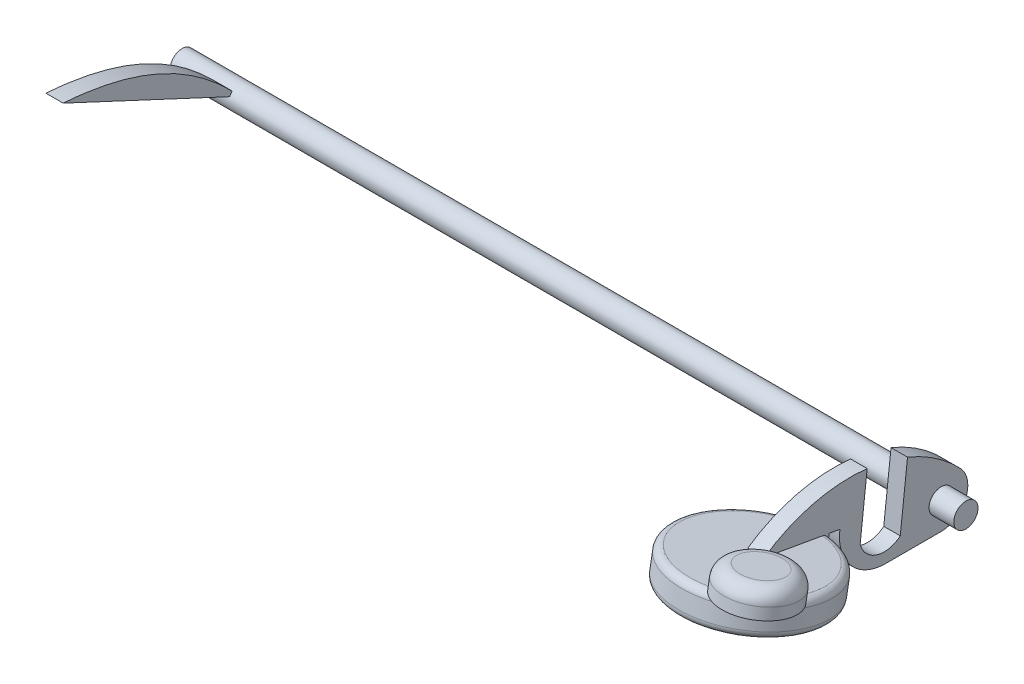
ISO-10303-21;
HEADER;
FILE_DESCRIPTION(('STEP AP214'),'2;1');
FILE_NAME('part.step','',(''),(''),'','','');
FILE_SCHEMA(('AUTOMOTIVE_DESIGN { 1 0 10303 214 1 1 1 1 }'));
ENDSEC;
DATA;
#1=APPLICATION_CONTEXT('core data for automotive mechanical design processes');
#2=APPLICATION_PROTOCOL_DEFINITION('international standard','automotive_design',2000,#1);
#3=PRODUCT_CONTEXT('',#1,'mechanical');
#4=PRODUCT('Part','Part','',(#3));
#5=PRODUCT_RELATED_PRODUCT_CATEGORY('part','',(#4));
#6=PRODUCT_DEFINITION_FORMATION('','',#4);
#7=PRODUCT_DEFINITION_CONTEXT('part definition',#1,'design');
#8=PRODUCT_DEFINITION('design','',#6,#7);
#9=PRODUCT_DEFINITION_SHAPE('','',#8);
#10=(LENGTH_UNIT() NAMED_UNIT(*) SI_UNIT(.MILLI.,.METRE.));
#11=(NAMED_UNIT(*) PLANE_ANGLE_UNIT() SI_UNIT($,.RADIAN.));
#12=(NAMED_UNIT(*) SI_UNIT($,.STERADIAN.) SOLID_ANGLE_UNIT());
#13=UNCERTAINTY_MEASURE_WITH_UNIT(LENGTH_MEASURE(1.E-05),#10,'distance_accuracy_value','');
#14=(GEOMETRIC_REPRESENTATION_CONTEXT(3) GLOBAL_UNCERTAINTY_ASSIGNED_CONTEXT((#13)) GLOBAL_UNIT_ASSIGNED_CONTEXT((#10,
#11,#12)) REPRESENTATION_CONTEXT('',''));
#15=CARTESIAN_POINT('',(0.,0.,0.));
#16=DIRECTION('',(0.,0.,1.));
#17=DIRECTION('',(1.,0.,0.));
#18=AXIS2_PLACEMENT_3D('',#15,#16,#17);
#19=CARTESIAN_POINT('',(144.7292,0.,0.));
#20=DIRECTION('',(-1.,0.,0.));
#21=DIRECTION('',(0.,0.,1.));
#22=AXIS2_PLACEMENT_3D('',#19,#20,#21);
#23=CYLINDRICAL_SURFACE('',#22,2.2352);
#24=CARTESIAN_POINT('',(144.7292,0.,0.));
#25=DIRECTION('',(1.,0.,0.));
#26=DIRECTION('',(0.,0.,-1.));
#27=AXIS2_PLACEMENT_3D('',#24,#25,#26);
#28=CIRCLE('',#27,2.2352);
#29=CARTESIAN_POINT('',(144.7292,0.,-2.2352));
#30=VERTEX_POINT('',#29);
#31=EDGE_CURVE('E288',#30,#30,#28,.T.);
#32=ORIENTED_EDGE('',*,*,#31,.F.);
#33=EDGE_LOOP('',(#32));
#34=FACE_BOUND('',#33,.T.);
#35=CARTESIAN_POINT('',(140.1572,0.,0.));
#36=DIRECTION('',(-1.,0.,0.));
#37=DIRECTION('',(0.,0.,1.));
#38=AXIS2_PLACEMENT_3D('',#35,#36,#37);
#39=CIRCLE('',#38,2.2352);
#40=CARTESIAN_POINT('',(140.1572,0.,2.2352));
#41=VERTEX_POINT('',#40);
#42=EDGE_CURVE('E292',#41,#41,#39,.T.);
#43=ORIENTED_EDGE('',*,*,#42,.F.);
#44=EDGE_LOOP('',(#43));
#45=FACE_BOUND('',#44,.T.);
#46=ADVANCED_FACE('F39',(#34,#45),#23,.T.);
#47=CARTESIAN_POINT('',(144.7292,0.,0.));
#48=DIRECTION('',(1.,0.,0.));
#49=DIRECTION('',(0.,0.,-1.));
#50=AXIS2_PLACEMENT_3D('',#47,#48,#49);
#51=PLANE('',#50);
#52=ORIENTED_EDGE('',*,*,#31,.T.);
#53=EDGE_LOOP('',(#52));
#54=FACE_BOUND('',#53,.T.);
#55=ADVANCED_FACE('F390',(#54),#51,.T.);
#56=CARTESIAN_POINT('',(140.1572,4.7752,18.6944));
#57=DIRECTION('',(0.,-0.984807753012208,0.173648177666931));
#58=DIRECTION('',(0.,-0.173648177666931,-0.984807753012208));
#59=AXIS2_PLACEMENT_3D('',#56,#57,#58);
#60=PLANE('',#59);
#61=DIRECTION('',(0.,0.173648177666931,0.984807753012208));
#62=VECTOR('',#61,1.);
#63=CARTESIAN_POINT('',(140.1572,4.7752,18.6944));
#64=LINE('',#63,#62);
#65=CARTESIAN_POINT('',(140.1572,4.7752,18.6944));
#66=VERTEX_POINT('',#65);
#67=CARTESIAN_POINT('',(140.1572,5.12159028491411,20.6588769253256));
#68=VERTEX_POINT('',#67);
#69=EDGE_CURVE('E189',#66,#68,#64,.T.);
#70=ORIENTED_EDGE('',*,*,#69,.T.);
#71=CARTESIAN_POINT('',(138.6332,7.35984893566567,33.3526725189349));
#72=DIRECTION('',(0.,-0.984807753012208,0.173648177666931));
#73=DIRECTION('',(0.,-0.173648177666931,-0.984807753012208));
#74=AXIS2_PLACEMENT_3D('',#71,#72,#73);
#75=CIRCLE('',#74,12.9794);
#76=CARTESIAN_POINT('',(137.1092,5.12159028491411,20.6588769253256));
#77=VERTEX_POINT('',#76);
#78=EDGE_CURVE('E181',#77,#68,#75,.T.);
#79=ORIENTED_EDGE('',*,*,#78,.F.);
#80=DIRECTION('',(0.,0.173648177666931,0.984807753012208));
#81=VECTOR('',#80,1.);
#82=CARTESIAN_POINT('',(137.1092,4.7752,18.6944));
#83=LINE('',#82,#81);
#84=CARTESIAN_POINT('',(137.1092,4.7752,18.6944));
#85=VERTEX_POINT('',#84);
#86=EDGE_CURVE('E225',#85,#77,#83,.T.);
#87=ORIENTED_EDGE('',*,*,#86,.F.);
#88=DIRECTION('',(-1.,0.,0.));
#89=VECTOR('',#88,1.);
#90=CARTESIAN_POINT('',(140.1572,4.7752,18.6944));
#91=LINE('',#90,#89);
#92=EDGE_CURVE('E260',#66,#85,#91,.T.);
#93=ORIENTED_EDGE('',*,*,#92,.F.);
#94=EDGE_LOOP('',(#70,#79,#87,#93));
#95=FACE_BOUND('',#94,.T.);
#96=ADVANCED_FACE('F359',(#95),#60,.T.);
#97=CARTESIAN_POINT('',(140.1572,3.58653961984732,10.2636432150542));
#98=DIRECTION('',(-1.,0.,0.));
#99=DIRECTION('',(0.,0.,1.));
#100=AXIS2_PLACEMENT_3D('',#97,#98,#99);
#101=CYLINDRICAL_SURFACE('',#100,8.51413961984732);
#102=CARTESIAN_POINT('',(137.1092,3.58653961984732,10.2636432150542));
#103=DIRECTION('',(-1.,0.,0.));
#104=DIRECTION('',(0.,0.,1.));
#105=AXIS2_PLACEMENT_3D('',#102,#103,#104);
#106=CIRCLE('',#105,8.51413961984732);
#107=CARTESIAN_POINT('',(137.1092,-4.9276,10.2636432150542));
#108=VERTEX_POINT('',#107);
#109=EDGE_CURVE('E194',#108,#85,#106,.T.);
#110=ORIENTED_EDGE('',*,*,#109,.F.);
#111=DIRECTION('',(-1.,0.,0.));
#112=VECTOR('',#111,1.);
#113=CARTESIAN_POINT('',(140.1572,-4.9276,10.2636432150542));
#114=LINE('',#113,#112);
#115=CARTESIAN_POINT('',(140.1572,-4.9276,10.2636432150542));
#116=VERTEX_POINT('',#115);
#117=EDGE_CURVE('E264',#116,#108,#114,.T.);
#118=ORIENTED_EDGE('',*,*,#117,.F.);
#119=CARTESIAN_POINT('',(140.1572,3.58653961984732,10.2636432150542));
#120=DIRECTION('',(-1.,0.,0.));
#121=DIRECTION('',(0.,0.,1.));
#122=AXIS2_PLACEMENT_3D('',#119,#120,#121);
#123=CIRCLE('',#122,8.51413961984732);
#124=EDGE_CURVE('E220',#116,#66,#123,.T.);
#125=ORIENTED_EDGE('',*,*,#124,.T.);
#126=ORIENTED_EDGE('',*,*,#92,.T.);
#127=EDGE_LOOP('',(#110,#118,#125,#126));
#128=FACE_BOUND('',#127,.T.);
#129=ADVANCED_FACE('F355',(#128),#101,.T.);
#130=CARTESIAN_POINT('',(140.1572,-4.9276,0.));
#131=DIRECTION('',(0.,-1.,0.));
#132=DIRECTION('',(0.,0.,-1.));
#133=AXIS2_PLACEMENT_3D('',#130,#131,#132);
#134=PLANE('',#133);
#135=DIRECTION('',(0.,0.,1.));
#136=VECTOR('',#135,1.);
#137=CARTESIAN_POINT('',(137.1092,-4.9276,0.));
#138=LINE('',#137,#136);
#139=CARTESIAN_POINT('',(137.1092,-4.9276,0.));
#140=VERTEX_POINT('',#139);
#141=EDGE_CURVE('E253',#140,#108,#138,.T.);
#142=ORIENTED_EDGE('',*,*,#141,.F.);
#143=DIRECTION('',(-1.,0.,0.));
#144=VECTOR('',#143,1.);
#145=CARTESIAN_POINT('',(140.1572,-4.9276,0.));
#146=LINE('',#145,#144);
#147=CARTESIAN_POINT('',(140.1572,-4.9276,0.));
#148=VERTEX_POINT('',#147);
#149=EDGE_CURVE('E267',#148,#140,#146,.T.);
#150=ORIENTED_EDGE('',*,*,#149,.F.);
#151=DIRECTION('',(0.,0.,1.));
#152=VECTOR('',#151,1.);
#153=CARTESIAN_POINT('',(140.1572,-4.9276,0.));
#154=LINE('',#153,#152);
#155=EDGE_CURVE('E216',#148,#116,#154,.T.);
#156=ORIENTED_EDGE('',*,*,#155,.T.);
#157=ORIENTED_EDGE('',*,*,#117,.T.);
#158=EDGE_LOOP('',(#142,#150,#156,#157));
#159=FACE_BOUND('',#158,.T.);
#160=ADVANCED_FACE('F358',(#159),#134,.T.);
#161=CARTESIAN_POINT('',(140.1572,0.,0.));
#162=DIRECTION('',(-1.,0.,0.));
#163=DIRECTION('',(0.,0.,1.));
#164=AXIS2_PLACEMENT_3D('',#161,#162,#163);
#165=CYLINDRICAL_SURFACE('',#164,4.9276);
#166=CARTESIAN_POINT('',(137.1092,0.,0.));
#167=DIRECTION('',(1.,0.,0.));
#168=DIRECTION('',(0.,0.,-1.));
#169=AXIS2_PLACEMENT_3D('',#166,#167,#168);
#170=CIRCLE('',#169,4.9276);
#171=CARTESIAN_POINT('',(137.1092,3.13344970104761,-3.80299023546007));
#172=VERTEX_POINT('',#171);
#173=EDGE_CURVE('E249',#140,#172,#170,.T.);
#174=ORIENTED_EDGE('',*,*,#173,.T.);
#175=DIRECTION('',(-1.,0.,0.));
#176=VECTOR('',#175,1.);
#177=CARTESIAN_POINT('',(140.1572,3.13344970104761,-3.80299023546007));
#178=LINE('',#177,#176);
#179=CARTESIAN_POINT('',(140.1572,3.13344970104761,-3.80299023546007));
#180=VERTEX_POINT('',#179);
#181=EDGE_CURVE('E270',#180,#172,#178,.T.);
#182=ORIENTED_EDGE('',*,*,#181,.F.);
#183=CARTESIAN_POINT('',(140.1572,0.,0.));
#184=DIRECTION('',(1.,0.,0.));
#185=DIRECTION('',(0.,0.,-1.));
#186=AXIS2_PLACEMENT_3D('',#183,#184,#185);
#187=CIRCLE('',#186,4.9276);
#188=EDGE_CURVE('E213',#148,#180,#187,.T.);
#189=ORIENTED_EDGE('',*,*,#188,.F.);
#190=ORIENTED_EDGE('',*,*,#149,.T.);
#191=EDGE_LOOP('',(#174,#182,#189,#190));
#192=FACE_BOUND('',#191,.T.);
#193=ADVANCED_FACE('F363',(#192),#165,.T.);
#194=CARTESIAN_POINT('',(140.1572,-15.8782677364398,16.795222317976));
#195=DIRECTION('',(-1.,0.,0.));
#196=DIRECTION('',(0.,0.,1.));
#197=AXIS2_PLACEMENT_3D('',#194,#195,#196);
#198=CYLINDRICAL_SURFACE('',#197,28.0309072332559);
#199=CARTESIAN_POINT('',(137.1092,-15.8782677364398,16.795222317976));
#200=DIRECTION('',(-1.,0.,0.));
#201=DIRECTION('',(0.,0.,1.));
#202=AXIS2_PLACEMENT_3D('',#199,#200,#201);
#203=CIRCLE('',#202,28.0309072332559);
#204=CARTESIAN_POINT('',(137.1092,10.0755838638352,6.20610774543991));
#205=VERTEX_POINT('',#204);
#206=EDGE_CURVE('E245',#205,#172,#203,.T.);
#207=ORIENTED_EDGE('',*,*,#206,.F.);
#208=DIRECTION('',(-1.,0.,0.));
#209=VECTOR('',#208,1.);
#210=CARTESIAN_POINT('',(140.1572,10.0755838638352,6.20610774543991));
#211=LINE('',#210,#209);
#212=CARTESIAN_POINT('',(140.1572,10.0755838638352,6.20610774543991));
#213=VERTEX_POINT('',#212);
#214=EDGE_CURVE('E273',#213,#205,#211,.T.);
#215=ORIENTED_EDGE('',*,*,#214,.F.);
#216=CARTESIAN_POINT('',(140.1572,-15.8782677364398,16.795222317976));
#217=DIRECTION('',(-1.,0.,0.));
#218=DIRECTION('',(0.,0.,1.));
#219=AXIS2_PLACEMENT_3D('',#216,#217,#218);
#220=CIRCLE('',#219,28.0309072332559);
#221=EDGE_CURVE('E209',#213,#180,#220,.T.);
#222=ORIENTED_EDGE('',*,*,#221,.T.);
#223=ORIENTED_EDGE('',*,*,#181,.T.);
#224=EDGE_LOOP('',(#207,#215,#222,#223));
#225=FACE_BOUND('',#224,.T.);
#226=ADVANCED_FACE('F367',(#225),#198,.T.);
#227=CARTESIAN_POINT('',(140.1572,10.0755838638352,6.20610774543991));
#228=DIRECTION('',(0.,-0.111840077706122,-0.993726218341193));
#229=DIRECTION('',(0.,0.993726218341193,-0.111840077706122));
#230=AXIS2_PLACEMENT_3D('',#227,#228,#229);
#231=PLANE('',#230);
#232=DIRECTION('',(0.,-0.993726218341193,0.111840077706122));
#233=VECTOR('',#232,1.);
#234=CARTESIAN_POINT('',(137.1092,10.0755838638352,6.20610774543991));
#235=LINE('',#234,#233);
#236=CARTESIAN_POINT('',(137.1092,-1.84147561968343,7.54732712162788));
#237=VERTEX_POINT('',#236);
#238=EDGE_CURVE('E241',#205,#237,#235,.T.);
#239=ORIENTED_EDGE('',*,*,#238,.T.);
#240=DIRECTION('',(-1.,0.,0.));
#241=VECTOR('',#240,1.);
#242=CARTESIAN_POINT('',(140.1572,-1.84147561968343,7.54732712162788));
#243=LINE('',#242,#241);
#244=CARTESIAN_POINT('',(140.1572,-1.84147561968343,7.54732712162788));
#245=VERTEX_POINT('',#244);
#246=EDGE_CURVE('E276',#245,#237,#243,.T.);
#247=ORIENTED_EDGE('',*,*,#246,.F.);
#248=DIRECTION('',(0.,-0.993726218341193,0.111840077706122));
#249=VECTOR('',#248,1.);
#250=CARTESIAN_POINT('',(140.1572,10.0755838638352,6.20610774543991));
#251=LINE('',#250,#249);
#252=EDGE_CURVE('E206',#213,#245,#251,.T.);
#253=ORIENTED_EDGE('',*,*,#252,.F.);
#254=ORIENTED_EDGE('',*,*,#214,.T.);
#255=EDGE_LOOP('',(#239,#247,#253,#254));
#256=FACE_BOUND('',#255,.T.);
#257=ADVANCED_FACE('F371',(#256),#231,.F.);
#258=CARTESIAN_POINT('',(140.1572,1.66682268507252,10.5143041798017));
#259=DIRECTION('',(-1.,0.,0.));
#260=DIRECTION('',(0.,0.,1.));
#261=AXIS2_PLACEMENT_3D('',#258,#259,#260);
#262=CYLINDRICAL_SURFACE('',#261,4.5946827810942);
#263=CARTESIAN_POINT('',(137.1092,1.66682268507252,10.5143041798017));
#264=DIRECTION('',(1.,0.,0.));
#265=DIRECTION('',(0.,0.,-1.));
#266=AXIS2_PLACEMENT_3D('',#263,#264,#265);
#267=CIRCLE('',#266,4.5946827810942);
#268=CARTESIAN_POINT('',(137.1092,0.482900652114931,14.9538355152876));
#269=VERTEX_POINT('',#268);
#270=EDGE_CURVE('E237',#269,#237,#267,.T.);
#271=ORIENTED_EDGE('',*,*,#270,.F.);
#272=DIRECTION('',(-1.,0.,0.));
#273=VECTOR('',#272,1.);
#274=CARTESIAN_POINT('',(140.1572,0.482900652114931,14.9538355152876));
#275=LINE('',#274,#273);
#276=CARTESIAN_POINT('',(140.1572,0.482900652114931,14.9538355152876));
#277=VERTEX_POINT('',#276);
#278=EDGE_CURVE('E279',#277,#269,#275,.T.);
#279=ORIENTED_EDGE('',*,*,#278,.F.);
#280=CARTESIAN_POINT('',(140.1572,1.66682268507252,10.5143041798017));
#281=DIRECTION('',(1.,0.,0.));
#282=DIRECTION('',(0.,0.,-1.));
#283=AXIS2_PLACEMENT_3D('',#280,#281,#282);
#284=CIRCLE('',#283,4.5946827810942);
#285=EDGE_CURVE('E202',#277,#245,#284,.T.);
#286=ORIENTED_EDGE('',*,*,#285,.T.);
#287=ORIENTED_EDGE('',*,*,#246,.T.);
#288=EDGE_LOOP('',(#271,#279,#286,#287));
#289=FACE_BOUND('',#288,.T.);
#290=ADVANCED_FACE('F375',(#289),#262,.F.);
#291=CARTESIAN_POINT('',(140.1572,11.9767797051363,13.6602434748356));
#292=DIRECTION('',(0.,-0.111840077706122,-0.993726218341193));
#293=DIRECTION('',(0.,0.993726218341193,-0.111840077706122));
#294=AXIS2_PLACEMENT_3D('',#291,#292,#293);
#295=PLANE('',#294);
#296=DIRECTION('',(0.,-0.993726218341193,0.111840077706122));
#297=VECTOR('',#296,1.);
#298=CARTESIAN_POINT('',(137.1092,11.9767797051363,13.6602434748356));
#299=LINE('',#298,#297);
#300=CARTESIAN_POINT('',(137.1092,11.9767797051363,13.6602434748356));
#301=VERTEX_POINT('',#300);
#302=EDGE_CURVE('E233',#301,#269,#299,.T.);
#303=ORIENTED_EDGE('',*,*,#302,.F.);
#304=DIRECTION('',(-1.,0.,0.));
#305=VECTOR('',#304,1.);
#306=CARTESIAN_POINT('',(140.1572,11.9767797051363,13.6602434748356));
#307=LINE('',#306,#305);
#308=CARTESIAN_POINT('',(140.1572,11.9767797051363,13.6602434748356));
#309=VERTEX_POINT('',#308);
#310=EDGE_CURVE('E282',#309,#301,#307,.T.);
#311=ORIENTED_EDGE('',*,*,#310,.F.);
#312=DIRECTION('',(0.,-0.993726218341193,0.111840077706122));
#313=VECTOR('',#312,1.);
#314=CARTESIAN_POINT('',(140.1572,11.9767797051363,13.6602434748356));
#315=LINE('',#314,#313);
#316=EDGE_CURVE('E198',#309,#277,#315,.T.);
#317=ORIENTED_EDGE('',*,*,#316,.T.);
#318=ORIENTED_EDGE('',*,*,#278,.T.);
#319=EDGE_LOOP('',(#303,#311,#317,#318));
#320=FACE_BOUND('',#319,.T.);
#321=ADVANCED_FACE('F379',(#320),#295,.T.);
#322=CARTESIAN_POINT('',(140.1572,-15.8782677364398,16.795222317976));
#323=DIRECTION('',(-1.,0.,0.));
#324=DIRECTION('',(0.,0.,1.));
#325=AXIS2_PLACEMENT_3D('',#322,#323,#324);
#326=CYLINDRICAL_SURFACE('',#325,28.0309072332559);
#327=CARTESIAN_POINT('',(137.1092,-15.8782677364398,16.795222317976));
#328=DIRECTION('',(-1.,0.,0.));
#329=DIRECTION('',(0.,0.,1.));
#330=AXIS2_PLACEMENT_3D('',#327,#328,#329);
#331=CIRCLE('',#330,28.0309072332559);
#332=CARTESIAN_POINT('',(137.1092,7.23635035170894,32.6522772449926));
#333=VERTEX_POINT('',#332);
#334=EDGE_CURVE('E229',#333,#301,#331,.T.);
#335=ORIENTED_EDGE('',*,*,#334,.F.);
#336=DIRECTION('',(-1.,0.,0.));
#337=VECTOR('',#336,1.);
#338=CARTESIAN_POINT('',(140.1572,7.23635035170894,32.6522772449926));
#339=LINE('',#338,#337);
#340=CARTESIAN_POINT('',(140.1572,7.23635035170895,32.6522772449926));
#341=VERTEX_POINT('',#340);
#342=EDGE_CURVE('E224',#341,#333,#339,.T.);
#343=ORIENTED_EDGE('',*,*,#342,.F.);
#344=CARTESIAN_POINT('',(140.1572,-15.8782677364398,16.795222317976));
#345=DIRECTION('',(-1.,0.,0.));
#346=DIRECTION('',(0.,0.,1.));
#347=AXIS2_PLACEMENT_3D('',#344,#345,#346);
#348=CIRCLE('',#347,28.0309072332559);
#349=EDGE_CURVE('E193',#341,#309,#348,.T.);
#350=ORIENTED_EDGE('',*,*,#349,.T.);
#351=ORIENTED_EDGE('',*,*,#310,.T.);
#352=EDGE_LOOP('',(#335,#343,#350,#351));
#353=FACE_BOUND('',#352,.T.);
#354=ADVANCED_FACE('F383',(#353),#326,.T.);
#355=CARTESIAN_POINT('',(140.1572,-15.8782677364398,16.795222317976));
#356=DIRECTION('',(-1.,0.,0.));
#357=DIRECTION('',(0.,0.,1.));
#358=AXIS2_PLACEMENT_3D('',#355,#356,#357);
#359=PLANE('',#358);
#360=ORIENTED_EDGE('',*,*,#42,.T.);
#361=EDGE_LOOP('',(#360));
#362=FACE_BOUND('',#361,.T.);
#363=ORIENTED_EDGE('',*,*,#69,.F.);
#364=ORIENTED_EDGE('',*,*,#124,.F.);
#365=ORIENTED_EDGE('',*,*,#155,.F.);
#366=ORIENTED_EDGE('',*,*,#188,.T.);
#367=ORIENTED_EDGE('',*,*,#221,.F.);
#368=ORIENTED_EDGE('',*,*,#252,.T.);
#369=ORIENTED_EDGE('',*,*,#285,.F.);
#370=ORIENTED_EDGE('',*,*,#316,.F.);
#371=ORIENTED_EDGE('',*,*,#349,.F.);
#372=DIRECTION('',(0.,0.173648177666931,0.984807753012208));
#373=VECTOR('',#372,1.);
#374=CARTESIAN_POINT('',(140.1572,3.82764323306288,13.3205385346138));
#375=LINE('',#374,#373);
#376=CARTESIAN_POINT('',(140.1572,5.34382820053874,21.9192507758373));
#377=VERTEX_POINT('',#376);
#378=EDGE_CURVE('E185',#377,#341,#375,.T.);
#379=ORIENTED_EDGE('',*,*,#378,.F.);
#380=CARTESIAN_POINT('',(140.1572,5.34382820053874,21.9192507758373));
#381=CARTESIAN_POINT('',(140.1572,5.3375377049055,21.8835778890396));
#382=CARTESIAN_POINT('',(140.1572,5.32974968044303,21.8481864913761));
#383=CARTESIAN_POINT('',(140.1572,5.31122982929124,21.7781834827591));
#384=CARTESIAN_POINT('',(140.1572,5.30049807292414,21.7435718531993));
#385=CARTESIAN_POINT('',(140.1572,5.26399732300881,21.6413239453116));
#386=CARTESIAN_POINT('',(140.1572,5.23390509679566,21.5751744542419));
#387=CARTESIAN_POINT('',(140.1572,5.16302643751664,21.4488666149757));
#388=CARTESIAN_POINT('',(140.1572,5.12223361988227,21.3887118732483));
#389=CARTESIAN_POINT('',(140.1572,5.03109102781454,21.2761489962437));
#390=CARTESIAN_POINT('',(140.1572,4.98074373634152,21.2237388546255));
#391=CARTESIAN_POINT('',(140.1572,4.87214557572174,21.1284113447146));
#392=CARTESIAN_POINT('',(140.1572,4.81393074041337,21.085452916376));
#393=CARTESIAN_POINT('',(140.1572,4.6910560298155,21.0099946548489));
#394=CARTESIAN_POINT('',(140.1572,4.62639496840252,20.9774967510951));
#395=CARTESIAN_POINT('',(140.1572,4.49298222677252,20.9241419050328));
#396=CARTESIAN_POINT('',(140.1572,4.42426322568286,20.9032031115139));
#397=CARTESIAN_POINT('',(140.1572,4.28429355808715,20.8732540320358));
#398=CARTESIAN_POINT('',(140.1572,4.21304467001404,20.8642355305099));
#399=CARTESIAN_POINT('',(140.1572,4.09628224868484,20.8594471714955));
#400=CARTESIAN_POINT('',(140.1572,4.05088720778859,20.8600380508772));
#401=CARTESIAN_POINT('',(140.1572,3.96048838804431,20.8660883972439));
#402=CARTESIAN_POINT('',(140.1572,3.91548414097061,20.8715408720489));
#403=CARTESIAN_POINT('',(140.1572,3.87088443858861,20.8794101109626));
#404=B_SPLINE_CURVE_WITH_KNOTS('',3,(#380,#381,#382,#383,#384,#385,#386,#387,#388,#389,#390,
#391,#392,#393,#394,#395,#396,#397,#398,#399,#400,#401,#402,#403),.UNSPECIFIED.,.F.,.F.,(4,2,2,
2,2,2,2,2,2,2,2,4),(0.,0.108603537860341,0.217204481537642,0.434104974366436,0.651135177635798,
0.868109057419351,1.08412088725064,1.30017253747699,1.51467401084533,1.72902757075413,
1.86498118266416,2.00073957440667),.UNSPECIFIED.);
#405=CARTESIAN_POINT('',(140.1572,3.87088443858861,20.8794101109626));
#406=VERTEX_POINT('',#405);
#407=EDGE_CURVE('E336',#377,#406,#404,.T.);
#408=ORIENTED_EDGE('',*,*,#407,.T.);
#409=DIRECTION('',(0.,0.984807753012208,-0.173648177666931));
#410=VECTOR('',#409,1.);
#411=CARTESIAN_POINT('',(140.1572,5.12159028491411,20.6588769253256));
#412=LINE('',#411,#410);
#413=EDGE_CURVE('E307',#68,#406,#412,.F.);
#414=ORIENTED_EDGE('',*,*,#413,.F.);
#415=EDGE_LOOP('',(#363,#364,#365,#366,#367,#368,#369,#370,#371,#379,#408,#414));
#416=FACE_BOUND('',#415,.T.);
#417=ADVANCED_FACE('F351',(#362,#416),#359,.F.);
#418=CARTESIAN_POINT('',(137.1092,-15.8782677364398,16.795222317976));
#419=DIRECTION('',(-1.,0.,0.));
#420=DIRECTION('',(0.,0.,1.));
#421=AXIS2_PLACEMENT_3D('',#418,#419,#420);
#422=PLANE('',#421);
#423=CARTESIAN_POINT('',(137.1092,0.,0.));
#424=DIRECTION('',(-1.,0.,0.));
#425=DIRECTION('',(0.,0.,1.));
#426=AXIS2_PLACEMENT_3D('',#423,#424,#425);
#427=CIRCLE('',#426,2.2352);
#428=CARTESIAN_POINT('',(137.1092,0.,2.2352));
#429=VERTEX_POINT('',#428);
#430=EDGE_CURVE('E263',#429,#429,#427,.T.);
#431=ORIENTED_EDGE('',*,*,#430,.F.);
#432=EDGE_LOOP('',(#431));
#433=FACE_BOUND('',#432,.T.);
#434=ORIENTED_EDGE('',*,*,#86,.T.);
#435=DIRECTION('',(0.,0.984807753012208,-0.173648177666931));
#436=VECTOR('',#435,1.);
#437=CARTESIAN_POINT('',(137.1092,3.87088443858861,20.8794101109626));
#438=LINE('',#437,#436);
#439=CARTESIAN_POINT('',(137.1092,3.87088443858861,20.8794101109626));
#440=VERTEX_POINT('',#439);
#441=EDGE_CURVE('E315',#440,#77,#438,.T.);
#442=ORIENTED_EDGE('',*,*,#441,.F.);
#443=CARTESIAN_POINT('',(137.1092,3.87088443858861,20.8794101109626));
#444=CARTESIAN_POINT('',(137.1092,3.90589067857571,20.873237687434));
#445=CARTESIAN_POINT('',(137.1092,3.94114116748765,20.8685488645191));
#446=CARTESIAN_POINT('',(137.1092,4.01190980365024,20.8621606132297));
#447=CARTESIAN_POINT('',(137.1092,4.04742793456171,20.8604610038289));
#448=CARTESIAN_POINT('',(137.1092,4.15392880301009,20.8598791392886));
#449=CARTESIAN_POINT('',(137.1092,4.22498783429985,20.8654911000759));
#450=CARTESIAN_POINT('',(137.1092,4.3651486695562,20.8885587685763));
#451=CARTESIAN_POINT('',(137.1092,4.4342496418358,20.9060194327477));
#452=CARTESIAN_POINT('',(137.1092,4.56855299111047,20.9522588071807));
#453=CARTESIAN_POINT('',(137.1092,4.63375585518893,20.9810360999672));
#454=CARTESIAN_POINT('',(137.1092,4.75861946094395,21.0491626498315));
#455=CARTESIAN_POINT('',(137.1092,4.81826387851466,21.0885418022902));
#456=CARTESIAN_POINT('',(137.1092,4.9301626294483,21.1767014016627));
#457=CARTESIAN_POINT('',(137.1092,4.98241546643858,21.2254837474766));
#458=CARTESIAN_POINT('',(137.1092,5.07841374279764,21.3314043387939));
#459=CARTESIAN_POINT('',(137.1092,5.12209888743814,21.388597172296));
#460=CARTESIAN_POINT('',(137.1092,5.19931367374729,21.5094552557415));
#461=CARTESIAN_POINT('',(137.1092,5.23284800637391,21.5731174977763));
#462=CARTESIAN_POINT('',(137.1092,5.27994078429144,21.6840488722779));
#463=CARTESIAN_POINT('',(137.1092,5.29646006835442,21.7300867210776));
#464=CARTESIAN_POINT('',(137.1092,5.32416785179664,21.8236674134155));
#465=CARTESIAN_POINT('',(137.1092,5.3353639873388,21.8712079961297));
#466=CARTESIAN_POINT('',(137.1092,5.34382820053874,21.9192507758373));
#467=B_SPLINE_CURVE_WITH_KNOTS('',3,(#443,#444,#445,#446,#447,#448,#449,#450,#451,#452,#453,
#454,#455,#456,#457,#458,#459,#460,#461,#462,#463,#464,#465,#466),.UNSPECIFIED.,.F.,.F.,(4,2,2,
2,2,2,2,2,2,2,2,4),(0.,0.106573042563793,0.213139630859402,0.425882467217253,0.63871435142252,
0.85151958565266,1.06493129489165,1.27838614616478,1.49329314465426,1.70810067679446,
1.85454140353372,2.00077141951296),.UNSPECIFIED.);
#468=CARTESIAN_POINT('',(137.1092,5.34382820053874,21.9192507758373));
#469=VERTEX_POINT('',#468);
#470=EDGE_CURVE('E327',#440,#469,#467,.T.);
#471=ORIENTED_EDGE('',*,*,#470,.T.);
#472=EDGE_CURVE('E188',#469,#333,#83,.T.);
#473=ORIENTED_EDGE('',*,*,#472,.T.);
#474=ORIENTED_EDGE('',*,*,#334,.T.);
#475=ORIENTED_EDGE('',*,*,#302,.T.);
#476=ORIENTED_EDGE('',*,*,#270,.T.);
#477=ORIENTED_EDGE('',*,*,#238,.F.);
#478=ORIENTED_EDGE('',*,*,#206,.T.);
#479=ORIENTED_EDGE('',*,*,#173,.F.);
#480=ORIENTED_EDGE('',*,*,#141,.T.);
#481=ORIENTED_EDGE('',*,*,#109,.T.);
#482=EDGE_LOOP('',(#434,#442,#471,#473,#474,#475,#476,#477,#478,#479,#480,#481));
#483=FACE_BOUND('',#482,.T.);
#484=ADVANCED_FACE('F346',(#433,#483),#422,.T.);
#485=CARTESIAN_POINT('',(0.,0.,0.));
#486=DIRECTION('',(1.,0.,0.));
#487=DIRECTION('',(0.,0.,-1.));
#488=AXIS2_PLACEMENT_3D('',#485,#486,#487);
#489=PLANE('',#488);
#490=CARTESIAN_POINT('',(0.,0.,0.));
#491=DIRECTION('',(1.,0.,0.));
#492=DIRECTION('',(0.,0.,-1.));
#493=AXIS2_PLACEMENT_3D('',#490,#491,#492);
#494=CIRCLE('',#493,2.2352);
#495=CARTESIAN_POINT('',(0.,0.,-2.2352));
#496=VERTEX_POINT('',#495);
#497=EDGE_CURVE('E293',#496,#496,#494,.T.);
#498=ORIENTED_EDGE('',*,*,#497,.F.);
#499=EDGE_LOOP('',(#498));
#500=FACE_BOUND('',#499,.T.);
#501=ADVANCED_FACE('F350',(#500),#489,.F.);
#502=DIRECTION('',(-1.,0.,0.));
#503=VECTOR('',#502,1.);
#504=CARTESIAN_POINT('',(10.795,1.61124225742786,1.54919896329644));
#505=LINE('',#504,#503);
#506=CARTESIAN_POINT('',(10.795,1.61124225742786,1.54919896329644));
#507=VERTEX_POINT('',#506);
#508=CARTESIAN_POINT('',(7.61999999999999,1.61124225742786,1.54919896329644));
#509=VERTEX_POINT('',#508);
#510=EDGE_CURVE('E48',#507,#509,#505,.T.);
#511=ORIENTED_EDGE('',*,*,#510,.F.);
#512=CARTESIAN_POINT('',(10.795,0.,0.));
#513=DIRECTION('',(1.,0.,0.));
#514=DIRECTION('',(0.,0.,-1.));
#515=AXIS2_PLACEMENT_3D('',#512,#513,#514);
#516=CIRCLE('',#515,2.2352);
#517=CARTESIAN_POINT('',(10.795,0.944636338642813,2.02577916558432));
#518=VERTEX_POINT('',#517);
#519=EDGE_CURVE('E11',#507,#518,#516,.T.);
#520=ORIENTED_EDGE('',*,*,#519,.T.);
#521=DIRECTION('',(-1.,0.,0.));
#522=VECTOR('',#521,1.);
#523=CARTESIAN_POINT('',(144.7292,0.944636338642813,2.02577916558432));
#524=LINE('',#523,#522);
#525=CARTESIAN_POINT('',(7.61999999999999,0.944636338642813,2.02577916558432));
#526=VERTEX_POINT('',#525);
#527=EDGE_CURVE('E162',#526,#518,#524,.F.);
#528=ORIENTED_EDGE('',*,*,#527,.F.);
#529=CARTESIAN_POINT('',(7.61999999999999,0.,0.));
#530=DIRECTION('',(1.,0.,0.));
#531=DIRECTION('',(0.,0.,-1.));
#532=AXIS2_PLACEMENT_3D('',#529,#530,#531);
#533=CIRCLE('',#532,2.2352);
#534=EDGE_CURVE('E462',#509,#526,#533,.T.);
#535=ORIENTED_EDGE('',*,*,#534,.F.);
#536=EDGE_LOOP('',(#511,#520,#528,#535));
#537=FACE_BOUND('',#536,.T.);
#538=ORIENTED_EDGE('',*,*,#430,.T.);
#539=EDGE_LOOP('',(#538));
#540=FACE_BOUND('',#539,.T.);
#541=ORIENTED_EDGE('',*,*,#497,.T.);
#542=EDGE_LOOP('',(#541));
#543=FACE_BOUND('',#542,.T.);
#544=ADVANCED_FACE('F397',(#537,#540,#543),#23,.T.);
#545=CARTESIAN_POINT('',(138.6332,7.35984893566567,33.3526725189349));
#546=DIRECTION('',(0.,-0.984807753012208,0.173648177666931));
#547=DIRECTION('',(0.,-0.173648177666931,-0.984807753012208));
#548=AXIS2_PLACEMENT_3D('',#545,#546,#547);
#549=PLANE('',#548);
#550=CARTESIAN_POINT('',(147.260956479419,8.73454454171419,41.1489587170262));
#551=DIRECTION('',(0.,0.984807753012208,-0.173648177666931));
#552=DIRECTION('',(0.,0.173648177666931,0.984807753012208));
#553=AXIS2_PLACEMENT_3D('',#550,#551,#552);
#554=CIRCLE('',#553,6.47700000000001);
#555=CARTESIAN_POINT('',(150.149234603926,7.72784360974091,35.439674023734));
#556=VERTEX_POINT('',#555);
#557=CARTESIAN_POINT('',(141.732845749786,9.32063018492398,44.4728155701008));
#558=VERTEX_POINT('',#557);
#559=EDGE_CURVE('E174',#556,#558,#554,.T.);
#560=ORIENTED_EDGE('',*,*,#559,.F.);
#561=CARTESIAN_POINT('',(138.6332,7.35984893566567,33.3526725189349));
#562=DIRECTION('',(0.,-0.984807753012208,0.173648177666931));
#563=DIRECTION('',(0.,-0.173648177666931,-0.984807753012208));
#564=AXIS2_PLACEMENT_3D('',#561,#562,#563);
#565=CIRCLE('',#564,11.7094);
#566=EDGE_CURVE('E322',#556,#377,#565,.F.);
#567=ORIENTED_EDGE('',*,*,#566,.T.);
#568=ORIENTED_EDGE('',*,*,#378,.T.);
#569=ORIENTED_EDGE('',*,*,#342,.T.);
#570=ORIENTED_EDGE('',*,*,#472,.F.);
#571=EDGE_CURVE('E323',#469,#558,#565,.F.);
#572=ORIENTED_EDGE('',*,*,#571,.T.);
#573=EDGE_LOOP('',(#560,#567,#568,#569,#570,#572));
#574=FACE_BOUND('',#573,.T.);
#575=ADVANCED_FACE('F400',(#574),#549,.F.);
#576=CARTESIAN_POINT('',(138.6332,1.7316726272009,34.3450718543014));
#577=DIRECTION('',(0.,0.984807753012208,-0.173648177666931));
#578=DIRECTION('',(0.,0.173648177666931,0.984807753012208));
#579=AXIS2_PLACEMENT_3D('',#576,#577,#578);
#580=CYLINDRICAL_SURFACE('',#579,12.9794);
#581=CARTESIAN_POINT('',(138.6332,2.9823784735264,34.1245386686644));
#582=DIRECTION('',(0.,-0.984807753012208,0.173648177666931));
#583=DIRECTION('',(0.,-0.173648177666931,-0.984807753012208));
#584=AXIS2_PLACEMENT_3D('',#581,#582,#583);
#585=CIRCLE('',#584,12.9794);
#586=CARTESIAN_POINT('',(138.6332,0.728529316316244,21.3423249192178));
#587=VERTEX_POINT('',#586);
#588=EDGE_CURVE('E318',#587,#587,#585,.F.);
#589=ORIENTED_EDGE('',*,*,#588,.T.);
#590=EDGE_LOOP('',(#589));
#591=FACE_BOUND('',#590,.T.);
#592=CARTESIAN_POINT('',(138.6332,6.10914308934017,33.5732057045719));
#593=DIRECTION('',(0.,-0.984807753012208,0.173648177666931));
#594=DIRECTION('',(0.,-0.173648177666931,-0.984807753012208));
#595=AXIS2_PLACEMENT_3D('',#592,#593,#594);
#596=CIRCLE('',#595,12.9794);
#597=EDGE_CURVE('E311',#406,#440,#596,.T.);
#598=ORIENTED_EDGE('',*,*,#597,.T.);
#599=ORIENTED_EDGE('',*,*,#441,.T.);
#600=ORIENTED_EDGE('',*,*,#78,.T.);
#601=ORIENTED_EDGE('',*,*,#413,.T.);
#602=EDGE_LOOP('',(#598,#599,#600,#601));
#603=FACE_BOUND('',#602,.T.);
#604=ADVANCED_FACE('F411',(#591,#603),#580,.T.);
#605=CARTESIAN_POINT('',(138.6332,1.7316726272009,34.3450718543014));
#606=DIRECTION('',(0.,-0.984807753012208,0.173648177666931));
#607=DIRECTION('',(0.,-0.173648177666931,-0.984807753012208));
#608=AXIS2_PLACEMENT_3D('',#605,#606,#607);
#609=PLANE('',#608);
#610=CARTESIAN_POINT('',(138.6332,1.7316726272009,34.3450718543014));
#611=DIRECTION('',(0.,-0.984807753012208,0.173648177666931));
#612=DIRECTION('',(0.,-0.173648177666931,-0.984807753012208));
#613=AXIS2_PLACEMENT_3D('',#610,#611,#612);
#614=CIRCLE('',#613,11.7094);
#615=CARTESIAN_POINT('',(138.6332,-0.301643344372258,22.8135639511803));
#616=VERTEX_POINT('',#615);
#617=EDGE_CURVE('E303',#616,#616,#614,.T.);
#618=ORIENTED_EDGE('',*,*,#617,.T.);
#619=EDGE_LOOP('',(#618));
#620=FACE_BOUND('',#619,.T.);
#621=ADVANCED_FACE('F403',(#620),#609,.T.);
#622=CARTESIAN_POINT('',(138.6332,2.9823784735264,34.1245386686644));
#623=DIRECTION('',(0.,-0.984807753012208,0.173648177666931));
#624=DIRECTION('',(0.,-0.173648177666931,-0.984807753012208));
#625=AXIS2_PLACEMENT_3D('',#622,#623,#624);
#626=TOROIDAL_SURFACE('',#625,11.7094,1.27);
#627=ORIENTED_EDGE('',*,*,#588,.F.);
#628=EDGE_LOOP('',(#627));
#629=FACE_BOUND('',#628,.T.);
#630=ORIENTED_EDGE('',*,*,#617,.F.);
#631=EDGE_LOOP('',(#630));
#632=FACE_BOUND('',#631,.T.);
#633=ADVANCED_FACE('F401',(#629,#632),#626,.T.);
#634=CARTESIAN_POINT('',(138.6332,6.10914308934017,33.5732057045719));
#635=DIRECTION('',(0.,-0.984807753012208,0.173648177666931));
#636=DIRECTION('',(0.,-0.173648177666931,-0.984807753012208));
#637=AXIS2_PLACEMENT_3D('',#634,#635,#636);
#638=TOROIDAL_SURFACE('',#637,11.7094,1.27);
#639=ORIENTED_EDGE('',*,*,#407,.F.);
#640=ORIENTED_EDGE('',*,*,#566,.F.);
#641=EDGE_CURVE('E328',#558,#556,#565,.F.);
#642=ORIENTED_EDGE('',*,*,#641,.F.);
#643=ORIENTED_EDGE('',*,*,#571,.F.);
#644=ORIENTED_EDGE('',*,*,#470,.F.);
#645=ORIENTED_EDGE('',*,*,#597,.F.);
#646=EDGE_LOOP('',(#639,#640,#642,#643,#644,#645));
#647=FACE_BOUND('',#646,.T.);
#648=ADVANCED_FACE('F343',(#647),#638,.T.);
#649=CARTESIAN_POINT('',(147.260956479419,13.2620997054125,40.3506285850203));
#650=DIRECTION('',(0.,-0.984807753012208,0.173648177666931));
#651=DIRECTION('',(0.,-0.173648177666931,-0.984807753012208));
#652=AXIS2_PLACEMENT_3D('',#649,#650,#651);
#653=CYLINDRICAL_SURFACE('',#652,6.47700000000001);
#654=CARTESIAN_POINT('',(147.260956479419,10.7606880127615,40.7916949562943));
#655=DIRECTION('',(0.,0.984807753012208,-0.173648177666931));
#656=DIRECTION('',(0.,0.173648177666931,0.984807753012208));
#657=AXIS2_PLACEMENT_3D('',#654,#655,#656);
#658=CIRCLE('',#657,6.47700000000001);
#659=CARTESIAN_POINT('',(147.260956479419,11.8854072595102,47.1702947725544));
#660=VERTEX_POINT('',#659);
#661=EDGE_CURVE('E457',#660,#660,#658,.F.);
#662=ORIENTED_EDGE('',*,*,#661,.T.);
#663=EDGE_LOOP('',(#662));
#664=FACE_BOUND('',#663,.T.);
#665=ORIENTED_EDGE('',*,*,#559,.T.);
#666=EDGE_CURVE('E170',#558,#556,#554,.T.);
#667=ORIENTED_EDGE('',*,*,#666,.T.);
#668=EDGE_LOOP('',(#665,#667));
#669=FACE_BOUND('',#668,.T.);
#670=ADVANCED_FACE('F409',(#664,#669),#653,.T.);
#671=CARTESIAN_POINT('',(147.260956479419,13.2620997054125,40.3506285850203));
#672=DIRECTION('',(0.,0.984807753012208,-0.173648177666931));
#673=DIRECTION('',(0.,0.173648177666931,0.984807753012208));
#674=AXIS2_PLACEMENT_3D('',#671,#672,#673);
#675=PLANE('',#674);
#676=CARTESIAN_POINT('',(147.260956479419,13.2620997054125,40.3506285850203));
#677=DIRECTION('',(0.,0.984807753012208,-0.173648177666931));
#678=DIRECTION('',(0.,0.173648177666931,0.984807753012208));
#679=AXIS2_PLACEMENT_3D('',#676,#677,#678);
#680=CIRCLE('',#679,3.93700000000001);
#681=CARTESIAN_POINT('',(147.260956479419,13.9457525808872,44.2278167086293));
#682=VERTEX_POINT('',#681);
#683=EDGE_CURVE('E454',#682,#682,#680,.T.);
#684=ORIENTED_EDGE('',*,*,#683,.T.);
#685=EDGE_LOOP('',(#684));
#686=FACE_BOUND('',#685,.T.);
#687=ADVANCED_FACE('F490',(#686),#675,.T.);
#688=CARTESIAN_POINT('',(147.260956479419,8.73454454171419,41.1489587170262));
#689=DIRECTION('',(0.,0.984807753012208,-0.173648177666931));
#690=DIRECTION('',(0.,0.173648177666931,0.984807753012208));
#691=AXIS2_PLACEMENT_3D('',#688,#689,#690);
#692=PLANE('',#691);
#693=ORIENTED_EDGE('',*,*,#666,.F.);
#694=ORIENTED_EDGE('',*,*,#641,.T.);
#695=EDGE_LOOP('',(#693,#694));
#696=FACE_BOUND('',#695,.T.);
#697=ADVANCED_FACE('F493',(#696),#692,.F.);
#698=CARTESIAN_POINT('',(147.260956479419,10.7606880127615,40.7916949562943));
#699=DIRECTION('',(0.,0.984807753012208,-0.173648177666931));
#700=DIRECTION('',(0.,0.173648177666931,0.984807753012208));
#701=AXIS2_PLACEMENT_3D('',#698,#699,#700);
#702=TOROIDAL_SURFACE('',#701,3.93700000000001,2.54);
#703=ORIENTED_EDGE('',*,*,#661,.F.);
#704=EDGE_LOOP('',(#703));
#705=FACE_BOUND('',#704,.T.);
#706=ORIENTED_EDGE('',*,*,#683,.F.);
#707=EDGE_LOOP('',(#706));
#708=FACE_BOUND('',#707,.T.);
#709=ADVANCED_FACE('F41',(#705,#708),#702,.T.);
#710=CARTESIAN_POINT('',(10.795,0.,0.));
#711=CARTESIAN_POINT('',(10.795,2.29071981100178,2.13472027183436));
#712=CARTESIAN_POINT('',(10.795,10.6236809299126,10.9403510184527));
#713=CARTESIAN_POINT('',(10.795,14.5895110959344,22.5819498220365));
#714=CARTESIAN_POINT('',(10.795,15.2751989760082,32.7577699162101));
#715=B_SPLINE_CURVE_WITH_KNOTS('',3,(#710,#711,#712,#713,#714),.UNSPECIFIED.,.F.,.F.,(4,1,4),
(0.,0.253451496797978,1.),.UNSPECIFIED.);
#716=DIRECTION('',(-1.,0.,0.));
#717=VECTOR('',#716,1.);
#718=SURFACE_OF_LINEAR_EXTRUSION('',#715,#717);
#719=CARTESIAN_POINT('',(10.795,15.2751989760082,32.7577699162101));
#720=VERTEX_POINT('',#719);
#721=EDGE_CURVE('E148',#507,#720,#715,.T.);
#722=ORIENTED_EDGE('',*,*,#721,.F.);
#723=ORIENTED_EDGE('',*,*,#510,.T.);
#724=CARTESIAN_POINT('',(7.62,0.,0.));
#725=CARTESIAN_POINT('',(7.62,2.29071981100178,2.13472027183436));
#726=CARTESIAN_POINT('',(7.62,10.6236809299126,10.9403510184527));
#727=CARTESIAN_POINT('',(7.62,14.5895110959344,22.5819498220365));
#728=CARTESIAN_POINT('',(7.62,15.2751989760082,32.7577699162101));
#729=B_SPLINE_CURVE_WITH_KNOTS('',3,(#724,#725,#726,#727,#728),.UNSPECIFIED.,.F.,.F.,(4,1,4),
(0.,0.253451496797978,1.),.UNSPECIFIED.);
#730=CARTESIAN_POINT('',(7.62,15.2751989760082,32.7577699162101));
#731=VERTEX_POINT('',#730);
#732=EDGE_CURVE('E167',#509,#731,#729,.T.);
#733=ORIENTED_EDGE('',*,*,#732,.T.);
#734=DIRECTION('',(-1.,0.,0.));
#735=VECTOR('',#734,1.);
#736=CARTESIAN_POINT('',(10.795,15.2751989760082,32.7577699162101));
#737=LINE('',#736,#735);
#738=EDGE_CURVE('E161',#720,#731,#737,.T.);
#739=ORIENTED_EDGE('',*,*,#738,.F.);
#740=EDGE_LOOP('',(#722,#723,#733,#739));
#741=FACE_BOUND('',#740,.T.);
#742=ADVANCED_FACE('F165',(#741),#718,.F.);
#743=CARTESIAN_POINT('',(10.795,0.,0.));
#744=DIRECTION('',(0.,0.906307787036649,-0.4226182617407));
#745=DIRECTION('',(0.,0.4226182617407,0.90630778703665));
#746=AXIS2_PLACEMENT_3D('',#743,#744,#745);
#747=PLANE('',#746);
#748=DIRECTION('',(0.,-0.4226182617407,-0.90630778703665));
#749=VECTOR('',#748,1.);
#750=CARTESIAN_POINT('',(7.62,0.,0.));
#751=LINE('',#750,#749);
#752=EDGE_CURVE('E155',#731,#526,#751,.T.);
#753=ORIENTED_EDGE('',*,*,#752,.T.);
#754=ORIENTED_EDGE('',*,*,#527,.T.);
#755=DIRECTION('',(0.,-0.4226182617407,-0.90630778703665));
#756=VECTOR('',#755,1.);
#757=CARTESIAN_POINT('',(10.795,0.,0.));
#758=LINE('',#757,#756);
#759=EDGE_CURVE('E151',#720,#518,#758,.T.);
#760=ORIENTED_EDGE('',*,*,#759,.F.);
#761=ORIENTED_EDGE('',*,*,#738,.T.);
#762=EDGE_LOOP('',(#753,#754,#760,#761));
#763=FACE_BOUND('',#762,.T.);
#764=ADVANCED_FACE('F160',(#763),#747,.F.);
#765=CARTESIAN_POINT('',(10.795,10.7882868252313,14.3388976129427));
#766=DIRECTION('',(1.,0.,0.));
#767=DIRECTION('',(0.,0.,-1.));
#768=AXIS2_PLACEMENT_3D('',#765,#766,#767);
#769=PLANE('',#768);
#770=ORIENTED_EDGE('',*,*,#519,.F.);
#771=ORIENTED_EDGE('',*,*,#721,.T.);
#772=ORIENTED_EDGE('',*,*,#759,.T.);
#773=EDGE_LOOP('',(#770,#771,#772));
#774=FACE_BOUND('',#773,.T.);
#775=ADVANCED_FACE('F150',(#774),#769,.T.);
#776=CARTESIAN_POINT('',(7.62,10.7882868252313,14.3388976129427));
#777=DIRECTION('',(1.,0.,0.));
#778=DIRECTION('',(0.,0.,-1.));
#779=AXIS2_PLACEMENT_3D('',#776,#777,#778);
#780=PLANE('',#779);
#781=ORIENTED_EDGE('',*,*,#732,.F.);
#782=ORIENTED_EDGE('',*,*,#534,.T.);
#783=ORIENTED_EDGE('',*,*,#752,.F.);
#784=EDGE_LOOP('',(#781,#782,#783));
#785=FACE_BOUND('',#784,.T.);
#786=ADVANCED_FACE('F471',(#785),#780,.F.);
#787=CLOSED_SHELL('',(#46,#55,#96,#129,#160,#193,#226,#257,#290,#321,#354,#417,#484,#501,#544,
#575,#604,#621,#633,#648,#670,#687,#697,#709,#742,#764,#775,#786));
#788=MANIFOLD_SOLID_BREP('B2',#787);
#789=ADVANCED_BREP_SHAPE_REPRESENTATION('',(#18,#788),#14);
#790=SHAPE_DEFINITION_REPRESENTATION(#9,#789);
ENDSEC;
END-ISO-10303-21;
